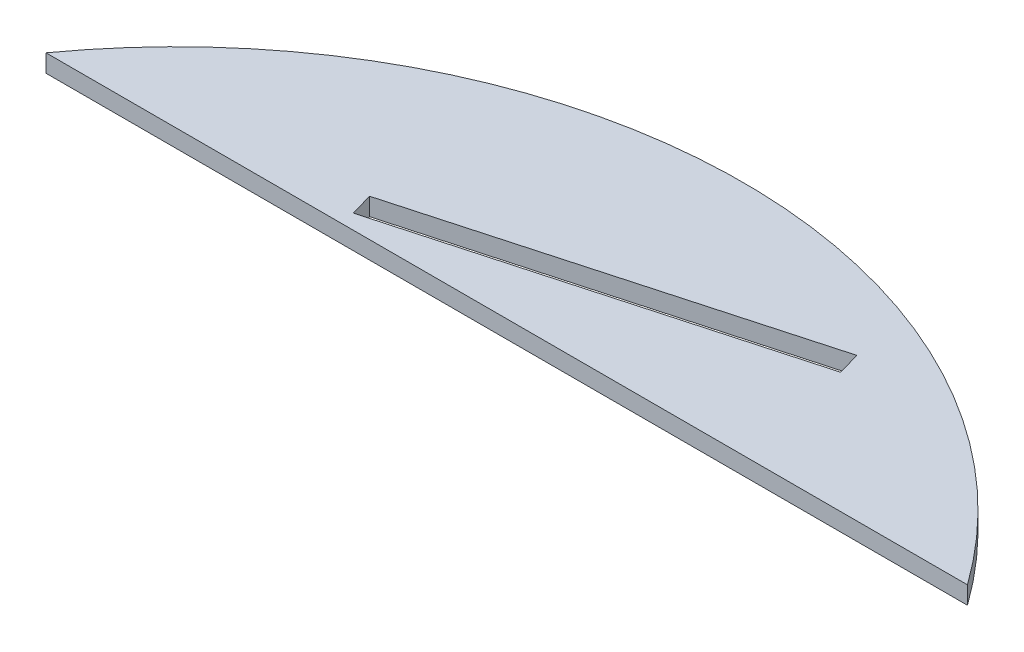
ISO-10303-21;
HEADER;
FILE_DESCRIPTION(('STEP AP214'),'2;1');
FILE_NAME('part.step','',(''),(''),'','','');
FILE_SCHEMA(('AUTOMOTIVE_DESIGN { 1 0 10303 214 1 1 1 1 }'));
ENDSEC;
DATA;
#1=APPLICATION_CONTEXT('core data for automotive mechanical design processes');
#2=APPLICATION_PROTOCOL_DEFINITION('international standard','automotive_design',2000,#1);
#3=PRODUCT_CONTEXT('',#1,'mechanical');
#4=PRODUCT('Part','Part','',(#3));
#5=PRODUCT_RELATED_PRODUCT_CATEGORY('part','',(#4));
#6=PRODUCT_DEFINITION_FORMATION('','',#4);
#7=PRODUCT_DEFINITION_CONTEXT('part definition',#1,'design');
#8=PRODUCT_DEFINITION('design','',#6,#7);
#9=PRODUCT_DEFINITION_SHAPE('','',#8);
#10=(LENGTH_UNIT() NAMED_UNIT(*) SI_UNIT(.MILLI.,.METRE.));
#11=(NAMED_UNIT(*) PLANE_ANGLE_UNIT() SI_UNIT($,.RADIAN.));
#12=(NAMED_UNIT(*) SI_UNIT($,.STERADIAN.) SOLID_ANGLE_UNIT());
#13=UNCERTAINTY_MEASURE_WITH_UNIT(LENGTH_MEASURE(1.E-05),#10,'distance_accuracy_value','');
#14=(GEOMETRIC_REPRESENTATION_CONTEXT(3) GLOBAL_UNCERTAINTY_ASSIGNED_CONTEXT((#13)) GLOBAL_UNIT_ASSIGNED_CONTEXT((#10,
#11,#12)) REPRESENTATION_CONTEXT('',''));
#15=CARTESIAN_POINT('',(0.,0.,0.));
#16=DIRECTION('',(0.,0.,1.));
#17=DIRECTION('',(1.,0.,0.));
#18=AXIS2_PLACEMENT_3D('',#15,#16,#17);
#19=CARTESIAN_POINT('',(0.,1.5,0.));
#20=DIRECTION('',(0.,-1.,0.));
#21=DIRECTION('',(0.,0.,-1.));
#22=AXIS2_PLACEMENT_3D('',#19,#20,#21);
#23=CYLINDRICAL_SURFACE('',#22,48.);
#24=CARTESIAN_POINT('',(0.,1.5,0.));
#25=DIRECTION('',(0.,1.,0.));
#26=DIRECTION('',(0.,0.,1.));
#27=AXIS2_PLACEMENT_3D('',#24,#25,#26);
#28=CIRCLE('',#27,48.);
#29=CARTESIAN_POINT('',(38.9871773792359,1.5,-28.));
#30=VERTEX_POINT('',#29);
#31=CARTESIAN_POINT('',(-38.9871773792359,1.5,-28.));
#32=VERTEX_POINT('',#31);
#33=EDGE_CURVE('E11',#30,#32,#28,.T.);
#34=ORIENTED_EDGE('',*,*,#33,.F.);
#35=DIRECTION('',(0.,1.,0.));
#36=VECTOR('',#35,1.);
#37=CARTESIAN_POINT('',(38.9871773792359,-122.441822920112,-28.));
#38=LINE('',#37,#36);
#39=CARTESIAN_POINT('',(38.9871773792359,0.,-28.));
#40=VERTEX_POINT('',#39);
#41=EDGE_CURVE('E134',#40,#30,#38,.T.);
#42=ORIENTED_EDGE('',*,*,#41,.F.);
#43=CARTESIAN_POINT('',(0.,0.,0.));
#44=DIRECTION('',(0.,1.,0.));
#45=DIRECTION('',(0.,0.,1.));
#46=AXIS2_PLACEMENT_3D('',#43,#44,#45);
#47=CIRCLE('',#46,48.);
#48=CARTESIAN_POINT('',(-38.9871773792359,0.,-28.));
#49=VERTEX_POINT('',#48);
#50=EDGE_CURVE('E41',#40,#49,#47,.T.);
#51=ORIENTED_EDGE('',*,*,#50,.T.);
#52=DIRECTION('',(0.,1.,0.));
#53=VECTOR('',#52,1.);
#54=CARTESIAN_POINT('',(-38.9871773792359,-122.441822920112,-28.));
#55=LINE('',#54,#53);
#56=EDGE_CURVE('E135',#49,#32,#55,.T.);
#57=ORIENTED_EDGE('',*,*,#56,.T.);
#58=EDGE_LOOP('',(#34,#42,#51,#57));
#59=FACE_BOUND('',#58,.T.);
#60=ADVANCED_FACE('F38',(#59),#23,.T.);
#61=CARTESIAN_POINT('',(0.,1.5,0.));
#62=DIRECTION('',(0.,1.,0.));
#63=DIRECTION('',(0.,0.,1.));
#64=AXIS2_PLACEMENT_3D('',#61,#62,#63);
#65=PLANE('',#64);
#66=DIRECTION('',(-0.26930059365983,0.,-0.96305617191027));
#67=VECTOR('',#66,1.);
#68=CARTESIAN_POINT('',(18.0366979693621,1.5,-38.2110536470978));
#69=LINE('',#68,#67);
#70=CARTESIAN_POINT('',(18.0366979693621,1.5,-38.2110536470978));
#71=VERTEX_POINT('',#70);
#72=CARTESIAN_POINT('',(17.4980967820424,1.5,-40.1371659909184));
#73=VERTEX_POINT('',#72);
#74=EDGE_CURVE('E53',#71,#73,#69,.T.);
#75=ORIENTED_EDGE('',*,*,#74,.F.);
#76=DIRECTION('',(0.963599917934122,0.,-0.267348458303678));
#77=VECTOR('',#76,1.);
#78=CARTESIAN_POINT('',(18.0366979693621,1.5,-38.2110536470978));
#79=LINE('',#78,#77);
#80=CARTESIAN_POINT('',(-14.2478046500074,1.5,-29.2537967588925));
#81=VERTEX_POINT('',#80);
#82=EDGE_CURVE('E112',#81,#71,#79,.T.);
#83=ORIENTED_EDGE('',*,*,#82,.F.);
#84=DIRECTION('',(0.267348458303663,0.,0.963599917934126));
#85=VECTOR('',#84,1.);
#86=CARTESIAN_POINT('',(-14.2478046500074,1.5,-29.2537967588925));
#87=LINE('',#86,#85);
#88=CARTESIAN_POINT('',(-14.7825015951962,1.5,-31.1809966977765));
#89=VERTEX_POINT('',#88);
#90=EDGE_CURVE('E94',#89,#81,#87,.T.);
#91=ORIENTED_EDGE('',*,*,#90,.F.);
#92=DIRECTION('',(-0.963599951559363,0.,0.267348337108713));
#93=VECTOR('',#92,1.);
#94=CARTESIAN_POINT('',(17.4980967820424,1.5,-40.1371659909184));
#95=LINE('',#94,#93);
#96=EDGE_CURVE('E104',#73,#89,#95,.T.);
#97=ORIENTED_EDGE('',*,*,#96,.F.);
#98=EDGE_LOOP('',(#75,#83,#91,#97));
#99=FACE_BOUND('',#98,.T.);
#100=DIRECTION('',(-1.,0.,0.));
#101=VECTOR('',#100,1.);
#102=CARTESIAN_POINT('',(-38.9871773792359,1.5,-28.));
#103=LINE('',#102,#101);
#104=EDGE_CURVE('E130',#30,#32,#103,.T.);
#105=ORIENTED_EDGE('',*,*,#104,.F.);
#106=ORIENTED_EDGE('',*,*,#33,.T.);
#107=EDGE_LOOP('',(#105,#106));
#108=FACE_BOUND('',#107,.T.);
#109=ADVANCED_FACE('F109',(#99,#108),#65,.T.);
#110=CARTESIAN_POINT('',(0.,0.,0.));
#111=DIRECTION('',(0.,1.,0.));
#112=DIRECTION('',(0.,0.,1.));
#113=AXIS2_PLACEMENT_3D('',#110,#111,#112);
#114=PLANE('',#113);
#115=DIRECTION('',(-0.963599917934122,0.,0.267348458303678));
#116=VECTOR('',#115,1.);
#117=CARTESIAN_POINT('',(18.0366979693621,0.,-38.2110536470978));
#118=LINE('',#117,#116);
#119=CARTESIAN_POINT('',(18.0366979693621,0.,-38.2110536470978));
#120=VERTEX_POINT('',#119);
#121=CARTESIAN_POINT('',(-14.2478046500074,0.,-29.2537967588925));
#122=VERTEX_POINT('',#121);
#123=EDGE_CURVE('E243',#120,#122,#118,.T.);
#124=ORIENTED_EDGE('',*,*,#123,.F.);
#125=DIRECTION('',(0.26930059365983,0.,0.96305617191027));
#126=VECTOR('',#125,1.);
#127=CARTESIAN_POINT('',(18.0366979693621,0.,-38.2110536470978));
#128=LINE('',#127,#126);
#129=CARTESIAN_POINT('',(17.4980967820424,0.,-40.1371659909184));
#130=VERTEX_POINT('',#129);
#131=EDGE_CURVE('E131',#130,#120,#128,.T.);
#132=ORIENTED_EDGE('',*,*,#131,.F.);
#133=DIRECTION('',(0.963599951559363,0.,-0.267348337108713));
#134=VECTOR('',#133,1.);
#135=CARTESIAN_POINT('',(17.4980967820424,0.,-40.1371659909184));
#136=LINE('',#135,#134);
#137=CARTESIAN_POINT('',(-14.7825015951962,0.,-31.1809966977765));
#138=VERTEX_POINT('',#137);
#139=EDGE_CURVE('E127',#138,#130,#136,.T.);
#140=ORIENTED_EDGE('',*,*,#139,.F.);
#141=DIRECTION('',(-0.267348458303663,0.,-0.963599917934126));
#142=VECTOR('',#141,1.);
#143=CARTESIAN_POINT('',(-14.2478046500074,0.,-29.2537967588925));
#144=LINE('',#143,#142);
#145=EDGE_CURVE('E97',#122,#138,#144,.T.);
#146=ORIENTED_EDGE('',*,*,#145,.F.);
#147=EDGE_LOOP('',(#124,#132,#140,#146));
#148=FACE_BOUND('',#147,.T.);
#149=ORIENTED_EDGE('',*,*,#50,.F.);
#150=DIRECTION('',(1.,0.,0.));
#151=VECTOR('',#150,1.);
#152=CARTESIAN_POINT('',(-38.9871773792359,0.,-28.));
#153=LINE('',#152,#151);
#154=EDGE_CURVE('E139',#49,#40,#153,.T.);
#155=ORIENTED_EDGE('',*,*,#154,.F.);
#156=EDGE_LOOP('',(#149,#155));
#157=FACE_BOUND('',#156,.T.);
#158=ADVANCED_FACE('F154',(#148,#157),#114,.F.);
#159=CARTESIAN_POINT('',(-38.9871773792359,-122.441822920112,-28.));
#160=DIRECTION('',(0.,0.,-1.));
#161=DIRECTION('',(-1.,0.,0.));
#162=AXIS2_PLACEMENT_3D('',#159,#160,#161);
#163=PLANE('',#162);
#164=ORIENTED_EDGE('',*,*,#154,.T.);
#165=ORIENTED_EDGE('',*,*,#41,.T.);
#166=ORIENTED_EDGE('',*,*,#104,.T.);
#167=ORIENTED_EDGE('',*,*,#56,.F.);
#168=EDGE_LOOP('',(#164,#165,#166,#167));
#169=FACE_BOUND('',#168,.T.);
#170=ADVANCED_FACE('F156',(#169),#163,.F.);
#171=CARTESIAN_POINT('',(18.0366979693621,-34.5766913671466,-38.2110536470978));
#172=DIRECTION('',(0.96305617191027,0.,-0.26930059365983));
#173=DIRECTION('',(-0.26930059365983,0.,-0.96305617191027));
#174=AXIS2_PLACEMENT_3D('',#171,#172,#173);
#175=PLANE('',#174);
#176=ORIENTED_EDGE('',*,*,#131,.T.);
#177=DIRECTION('',(0.,1.,0.));
#178=VECTOR('',#177,1.);
#179=CARTESIAN_POINT('',(18.0366979693621,-34.5766913671466,-38.2110536470978));
#180=LINE('',#179,#178);
#181=EDGE_CURVE('E120',#120,#71,#180,.T.);
#182=ORIENTED_EDGE('',*,*,#181,.T.);
#183=ORIENTED_EDGE('',*,*,#74,.T.);
#184=DIRECTION('',(0.,1.,0.));
#185=VECTOR('',#184,1.);
#186=CARTESIAN_POINT('',(17.4980967820424,-34.5766913671466,-40.1371659909184));
#187=LINE('',#186,#185);
#188=EDGE_CURVE('E101',#130,#73,#187,.T.);
#189=ORIENTED_EDGE('',*,*,#188,.F.);
#190=EDGE_LOOP('',(#176,#182,#183,#189));
#191=FACE_BOUND('',#190,.T.);
#192=ADVANCED_FACE('F162',(#191),#175,.F.);
#193=CARTESIAN_POINT('',(18.0366979693621,-34.5766913671466,-38.2110536470978));
#194=DIRECTION('',(0.267348458303678,0.,0.963599917934122));
#195=DIRECTION('',(0.963599917934122,0.,-0.267348458303678));
#196=AXIS2_PLACEMENT_3D('',#193,#194,#195);
#197=PLANE('',#196);
#198=ORIENTED_EDGE('',*,*,#123,.T.);
#199=DIRECTION('',(0.,1.,0.));
#200=VECTOR('',#199,1.);
#201=CARTESIAN_POINT('',(-14.2478046500074,-34.5766913671466,-29.2537967588925));
#202=LINE('',#201,#200);
#203=EDGE_CURVE('E100',#122,#81,#202,.T.);
#204=ORIENTED_EDGE('',*,*,#203,.T.);
#205=ORIENTED_EDGE('',*,*,#82,.T.);
#206=ORIENTED_EDGE('',*,*,#181,.F.);
#207=EDGE_LOOP('',(#198,#204,#205,#206));
#208=FACE_BOUND('',#207,.T.);
#209=ADVANCED_FACE('F191',(#208),#197,.F.);
#210=CARTESIAN_POINT('',(-14.2478046500074,-34.5766913671466,-29.2537967588925));
#211=DIRECTION('',(-0.963599917934126,0.,0.267348458303663));
#212=DIRECTION('',(0.267348458303663,0.,0.963599917934126));
#213=AXIS2_PLACEMENT_3D('',#210,#211,#212);
#214=PLANE('',#213);
#215=ORIENTED_EDGE('',*,*,#145,.T.);
#216=DIRECTION('',(0.,1.,0.));
#217=VECTOR('',#216,1.);
#218=CARTESIAN_POINT('',(-14.7825015951962,-34.5766913671466,-31.1809966977765));
#219=LINE('',#218,#217);
#220=EDGE_CURVE('E61',#138,#89,#219,.T.);
#221=ORIENTED_EDGE('',*,*,#220,.T.);
#222=ORIENTED_EDGE('',*,*,#90,.T.);
#223=ORIENTED_EDGE('',*,*,#203,.F.);
#224=EDGE_LOOP('',(#215,#221,#222,#223));
#225=FACE_BOUND('',#224,.T.);
#226=ADVANCED_FACE('F91',(#225),#214,.F.);
#227=CARTESIAN_POINT('',(17.4980967820424,-34.5766913671466,-40.1371659909184));
#228=DIRECTION('',(-0.267348337108713,0.,-0.963599951559363));
#229=DIRECTION('',(-0.963599951559363,0.,0.267348337108713));
#230=AXIS2_PLACEMENT_3D('',#227,#228,#229);
#231=PLANE('',#230);
#232=ORIENTED_EDGE('',*,*,#139,.T.);
#233=ORIENTED_EDGE('',*,*,#188,.T.);
#234=ORIENTED_EDGE('',*,*,#96,.T.);
#235=ORIENTED_EDGE('',*,*,#220,.F.);
#236=EDGE_LOOP('',(#232,#233,#234,#235));
#237=FACE_BOUND('',#236,.T.);
#238=ADVANCED_FACE('F105',(#237),#231,.F.);
#239=CLOSED_SHELL('',(#60,#109,#158,#170,#192,#209,#226,#238));
#240=MANIFOLD_SOLID_BREP('B2',#239);
#241=ADVANCED_BREP_SHAPE_REPRESENTATION('',(#18,#240),#14);
#242=SHAPE_DEFINITION_REPRESENTATION(#9,#241);
ENDSEC;
END-ISO-10303-21;
